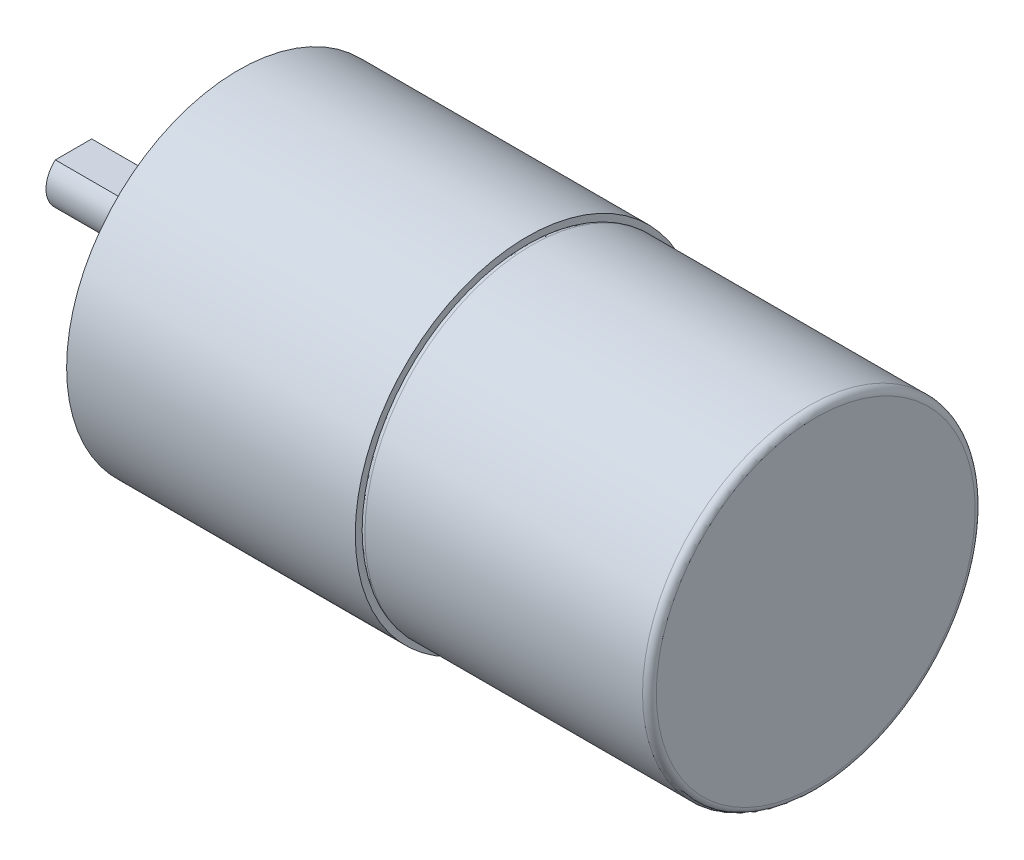
ISO-10303-21;
HEADER;
FILE_DESCRIPTION(('STEP AP214'),'2;1');
FILE_NAME('part.step','',(''),(''),'','','');
FILE_SCHEMA(('AUTOMOTIVE_DESIGN { 1 0 10303 214 1 1 1 1 }'));
ENDSEC;
DATA;
#1=APPLICATION_CONTEXT('core data for automotive mechanical design processes');
#2=APPLICATION_PROTOCOL_DEFINITION('international standard','automotive_design',2000,#1);
#3=PRODUCT_CONTEXT('',#1,'mechanical');
#4=PRODUCT('Part','Part','',(#3));
#5=PRODUCT_RELATED_PRODUCT_CATEGORY('part','',(#4));
#6=PRODUCT_DEFINITION_FORMATION('','',#4);
#7=PRODUCT_DEFINITION_CONTEXT('part definition',#1,'design');
#8=PRODUCT_DEFINITION('design','',#6,#7);
#9=PRODUCT_DEFINITION_SHAPE('','',#8);
#10=(LENGTH_UNIT() NAMED_UNIT(*) SI_UNIT(.MILLI.,.METRE.));
#11=(NAMED_UNIT(*) PLANE_ANGLE_UNIT() SI_UNIT($,.RADIAN.));
#12=(NAMED_UNIT(*) SI_UNIT($,.STERADIAN.) SOLID_ANGLE_UNIT());
#13=UNCERTAINTY_MEASURE_WITH_UNIT(LENGTH_MEASURE(1.E-05),#10,'distance_accuracy_value','');
#14=(GEOMETRIC_REPRESENTATION_CONTEXT(3) GLOBAL_UNCERTAINTY_ASSIGNED_CONTEXT((#13)) GLOBAL_UNIT_ASSIGNED_CONTEXT((#10,
#11,#12)) REPRESENTATION_CONTEXT('',''));
#15=CARTESIAN_POINT('',(0.,0.,0.));
#16=DIRECTION('',(0.,0.,1.));
#17=DIRECTION('',(1.,0.,0.));
#18=AXIS2_PLACEMENT_3D('',#15,#16,#17);
#19=CARTESIAN_POINT('',(-17.5,2.,0.));
#20=DIRECTION('',(1.,0.,0.));
#21=DIRECTION('',(0.,0.,-1.));
#22=AXIS2_PLACEMENT_3D('',#19,#20,#21);
#23=PLANE('',#22);
#24=CARTESIAN_POINT('',(-17.5,0.,0.));
#25=DIRECTION('',(-1.,0.,0.));
#26=DIRECTION('',(0.,0.,1.));
#27=AXIS2_PLACEMENT_3D('',#24,#25,#26);
#28=CIRCLE('',#27,2.);
#29=CARTESIAN_POINT('',(-17.5,0.,2.));
#30=VERTEX_POINT('',#29);
#31=EDGE_CURVE('E90',#30,#30,#28,.T.);
#32=ORIENTED_EDGE('',*,*,#31,.F.);
#33=EDGE_LOOP('',(#32));
#34=FACE_BOUND('',#33,.T.);
#35=CARTESIAN_POINT('',(-17.5,0.,0.));
#36=DIRECTION('',(-1.,0.,0.));
#37=DIRECTION('',(0.,0.,1.));
#38=AXIS2_PLACEMENT_3D('',#35,#36,#37);
#39=CIRCLE('',#38,3.5);
#40=CARTESIAN_POINT('',(-17.5,0.,3.5));
#41=VERTEX_POINT('',#40);
#42=EDGE_CURVE('E111',#41,#41,#39,.T.);
#43=ORIENTED_EDGE('',*,*,#42,.T.);
#44=EDGE_LOOP('',(#43));
#45=FACE_BOUND('',#44,.T.);
#46=ADVANCED_FACE('F45',(#34,#45),#23,.F.);
#47=CARTESIAN_POINT('',(-27.,0.,0.));
#48=DIRECTION('',(-1.,0.,0.));
#49=DIRECTION('',(0.,0.,1.));
#50=AXIS2_PLACEMENT_3D('',#47,#48,#49);
#51=CYLINDRICAL_SURFACE('',#50,3.5);
#52=ORIENTED_EDGE('',*,*,#42,.F.);
#53=EDGE_LOOP('',(#52));
#54=FACE_BOUND('',#53,.T.);
#55=CARTESIAN_POINT('',(-15.,0.,0.));
#56=DIRECTION('',(-1.,0.,0.));
#57=DIRECTION('',(0.,0.,1.));
#58=AXIS2_PLACEMENT_3D('',#55,#56,#57);
#59=CIRCLE('',#58,3.5);
#60=CARTESIAN_POINT('',(-15.,0.,3.5));
#61=VERTEX_POINT('',#60);
#62=EDGE_CURVE('E107',#61,#61,#59,.T.);
#63=ORIENTED_EDGE('',*,*,#62,.T.);
#64=EDGE_LOOP('',(#63));
#65=FACE_BOUND('',#64,.T.);
#66=ADVANCED_FACE('F159',(#54,#65),#51,.T.);
#67=CARTESIAN_POINT('',(-15.,3.5,0.));
#68=DIRECTION('',(1.,0.,0.));
#69=DIRECTION('',(0.,0.,-1.));
#70=AXIS2_PLACEMENT_3D('',#67,#68,#69);
#71=PLANE('',#70);
#72=CARTESIAN_POINT('',(-15.,8.5,0.));
#73=DIRECTION('',(-1.,0.,0.));
#74=DIRECTION('',(0.,0.,1.));
#75=AXIS2_PLACEMENT_3D('',#72,#73,#74);
#76=CIRCLE('',#75,1.5);
#77=CARTESIAN_POINT('',(-15.,8.5,1.5));
#78=VERTEX_POINT('',#77);
#79=EDGE_CURVE('E179',#78,#78,#76,.T.);
#80=ORIENTED_EDGE('',*,*,#79,.F.);
#81=EDGE_LOOP('',(#80));
#82=FACE_BOUND('',#81,.T.);
#83=CARTESIAN_POINT('',(-15.,-8.5,0.));
#84=DIRECTION('',(-1.,0.,0.));
#85=DIRECTION('',(0.,0.,1.));
#86=AXIS2_PLACEMENT_3D('',#83,#84,#85);
#87=CIRCLE('',#86,1.5);
#88=CARTESIAN_POINT('',(-15.,-8.5,1.5));
#89=VERTEX_POINT('',#88);
#90=EDGE_CURVE('E183',#89,#89,#87,.T.);
#91=ORIENTED_EDGE('',*,*,#90,.F.);
#92=EDGE_LOOP('',(#91));
#93=FACE_BOUND('',#92,.T.);
#94=ORIENTED_EDGE('',*,*,#62,.F.);
#95=EDGE_LOOP('',(#94));
#96=FACE_BOUND('',#95,.T.);
#97=CARTESIAN_POINT('',(-15.,0.,0.));
#98=DIRECTION('',(-1.,0.,0.));
#99=DIRECTION('',(0.,0.,1.));
#100=AXIS2_PLACEMENT_3D('',#97,#98,#99);
#101=CIRCLE('',#100,12.5);
#102=CARTESIAN_POINT('',(-15.,0.,12.5));
#103=VERTEX_POINT('',#102);
#104=EDGE_CURVE('E103',#103,#103,#101,.T.);
#105=ORIENTED_EDGE('',*,*,#104,.T.);
#106=EDGE_LOOP('',(#105));
#107=FACE_BOUND('',#106,.T.);
#108=ADVANCED_FACE('F154',(#82,#93,#96,#107),#71,.F.);
#109=CARTESIAN_POINT('',(-27.,0.,0.));
#110=DIRECTION('',(-1.,0.,0.));
#111=DIRECTION('',(0.,0.,1.));
#112=AXIS2_PLACEMENT_3D('',#109,#110,#111);
#113=CYLINDRICAL_SURFACE('',#112,12.5);
#114=ORIENTED_EDGE('',*,*,#104,.F.);
#115=EDGE_LOOP('',(#114));
#116=FACE_BOUND('',#115,.T.);
#117=CARTESIAN_POINT('',(6.,0.,0.));
#118=DIRECTION('',(-1.,0.,0.));
#119=DIRECTION('',(0.,0.,1.));
#120=AXIS2_PLACEMENT_3D('',#117,#118,#119);
#121=CIRCLE('',#120,12.5);
#122=CARTESIAN_POINT('',(6.,0.,12.5));
#123=VERTEX_POINT('',#122);
#124=EDGE_CURVE('E95',#123,#123,#121,.T.);
#125=ORIENTED_EDGE('',*,*,#124,.T.);
#126=EDGE_LOOP('',(#125));
#127=FACE_BOUND('',#126,.T.);
#128=ADVANCED_FACE('F148',(#116,#127),#113,.T.);
#129=CARTESIAN_POINT('',(6.,12.5,0.));
#130=DIRECTION('',(-1.,0.,0.));
#131=DIRECTION('',(0.,0.,1.));
#132=AXIS2_PLACEMENT_3D('',#129,#130,#131);
#133=PLANE('',#132);
#134=ORIENTED_EDGE('',*,*,#124,.F.);
#135=EDGE_LOOP('',(#134));
#136=FACE_BOUND('',#135,.T.);
#137=CARTESIAN_POINT('',(6.,0.,0.));
#138=DIRECTION('',(-1.,0.,0.));
#139=DIRECTION('',(0.,0.,1.));
#140=AXIS2_PLACEMENT_3D('',#137,#138,#139);
#141=CIRCLE('',#140,12.);
#142=CARTESIAN_POINT('',(6.,0.,12.));
#143=VERTEX_POINT('',#142);
#144=EDGE_CURVE('E89',#143,#143,#141,.T.);
#145=ORIENTED_EDGE('',*,*,#144,.T.);
#146=EDGE_LOOP('',(#145));
#147=FACE_BOUND('',#146,.T.);
#148=ADVANCED_FACE('F138',(#136,#147),#133,.F.);
#149=CARTESIAN_POINT('',(-27.,0.,0.));
#150=DIRECTION('',(-1.,0.,0.));
#151=DIRECTION('',(0.,0.,1.));
#152=AXIS2_PLACEMENT_3D('',#149,#150,#151);
#153=CYLINDRICAL_SURFACE('',#152,12.1);
#154=CARTESIAN_POINT('',(26.5,0.,0.));
#155=DIRECTION('',(-1.,0.,0.));
#156=DIRECTION('',(0.,0.,1.));
#157=AXIS2_PLACEMENT_3D('',#154,#155,#156);
#158=CIRCLE('',#157,12.1);
#159=CARTESIAN_POINT('',(26.5,0.,12.1));
#160=VERTEX_POINT('',#159);
#161=EDGE_CURVE('E119',#160,#160,#158,.T.);
#162=ORIENTED_EDGE('',*,*,#161,.T.);
#163=EDGE_LOOP('',(#162));
#164=FACE_BOUND('',#163,.T.);
#165=CARTESIAN_POINT('',(6.3,0.,0.));
#166=DIRECTION('',(-1.,0.,0.));
#167=DIRECTION('',(0.,0.,1.));
#168=AXIS2_PLACEMENT_3D('',#165,#166,#167);
#169=CIRCLE('',#168,12.1);
#170=CARTESIAN_POINT('',(6.3,0.,12.1));
#171=VERTEX_POINT('',#170);
#172=EDGE_CURVE('E115',#171,#171,#169,.F.);
#173=ORIENTED_EDGE('',*,*,#172,.T.);
#174=EDGE_LOOP('',(#173));
#175=FACE_BOUND('',#174,.T.);
#176=ADVANCED_FACE('F135',(#164,#175),#153,.T.);
#177=CARTESIAN_POINT('',(27.,12.1,0.));
#178=DIRECTION('',(-1.,0.,0.));
#179=DIRECTION('',(0.,0.,1.));
#180=AXIS2_PLACEMENT_3D('',#177,#178,#179);
#181=PLANE('',#180);
#182=CARTESIAN_POINT('',(27.,0.,0.));
#183=DIRECTION('',(-1.,0.,0.));
#184=DIRECTION('',(0.,0.,1.));
#185=AXIS2_PLACEMENT_3D('',#182,#183,#184);
#186=CIRCLE('',#185,11.6);
#187=CARTESIAN_POINT('',(27.,0.,11.6));
#188=VERTEX_POINT('',#187);
#189=EDGE_CURVE('E77',#188,#188,#186,.F.);
#190=ORIENTED_EDGE('',*,*,#189,.T.);
#191=EDGE_LOOP('',(#190));
#192=FACE_BOUND('',#191,.T.);
#193=ADVANCED_FACE('F128',(#192),#181,.F.);
#194=CARTESIAN_POINT('',(-27.,0.,0.));
#195=DIRECTION('',(1.,0.,0.));
#196=DIRECTION('',(0.,0.,-1.));
#197=AXIS2_PLACEMENT_3D('',#194,#195,#196);
#198=PLANE('',#197);
#199=CARTESIAN_POINT('',(-27.,0.,0.));
#200=DIRECTION('',(-1.,0.,0.));
#201=DIRECTION('',(0.,0.,1.));
#202=AXIS2_PLACEMENT_3D('',#199,#200,#201);
#203=CIRCLE('',#202,2.);
#204=CARTESIAN_POINT('',(-27.,1.5,-1.3228756555323));
#205=VERTEX_POINT('',#204);
#206=CARTESIAN_POINT('',(-27.,1.5,1.3228756555323));
#207=VERTEX_POINT('',#206);
#208=EDGE_CURVE('E82',#205,#207,#203,.T.);
#209=ORIENTED_EDGE('',*,*,#208,.T.);
#210=DIRECTION('',(0.,0.,1.));
#211=VECTOR('',#210,1.);
#212=CARTESIAN_POINT('',(-27.,1.5,-5.));
#213=LINE('',#212,#211);
#214=EDGE_CURVE('E74',#205,#207,#213,.T.);
#215=ORIENTED_EDGE('',*,*,#214,.F.);
#216=EDGE_LOOP('',(#209,#215));
#217=FACE_BOUND('',#216,.T.);
#218=ADVANCED_FACE('F81',(#217),#198,.F.);
#219=CARTESIAN_POINT('',(-27.,0.,0.));
#220=DIRECTION('',(-1.,0.,0.));
#221=DIRECTION('',(0.,0.,1.));
#222=AXIS2_PLACEMENT_3D('',#219,#220,#221);
#223=CYLINDRICAL_SURFACE('',#222,2.);
#224=CARTESIAN_POINT('',(-19.,0.,0.));
#225=DIRECTION('',(1.,0.,0.));
#226=DIRECTION('',(0.,0.,-1.));
#227=AXIS2_PLACEMENT_3D('',#224,#225,#226);
#228=CIRCLE('',#227,2.);
#229=CARTESIAN_POINT('',(-19.,1.5,-1.3228756555323));
#230=VERTEX_POINT('',#229);
#231=CARTESIAN_POINT('',(-19.,1.5,1.3228756555323));
#232=VERTEX_POINT('',#231);
#233=EDGE_CURVE('E54',#230,#232,#228,.T.);
#234=ORIENTED_EDGE('',*,*,#233,.T.);
#235=DIRECTION('',(-1.,0.,0.));
#236=VECTOR('',#235,1.);
#237=CARTESIAN_POINT('',(-27.,1.5,1.3228756555323));
#238=LINE('',#237,#236);
#239=EDGE_CURVE('E11',#232,#207,#238,.T.);
#240=ORIENTED_EDGE('',*,*,#239,.T.);
#241=ORIENTED_EDGE('',*,*,#208,.F.);
#242=DIRECTION('',(-1.,0.,0.));
#243=VECTOR('',#242,1.);
#244=CARTESIAN_POINT('',(-27.,1.5,-1.3228756555323));
#245=LINE('',#244,#243);
#246=EDGE_CURVE('E71',#205,#230,#245,.F.);
#247=ORIENTED_EDGE('',*,*,#246,.T.);
#248=EDGE_LOOP('',(#234,#240,#241,#247));
#249=FACE_BOUND('',#248,.T.);
#250=ORIENTED_EDGE('',*,*,#31,.T.);
#251=EDGE_LOOP('',(#250));
#252=FACE_BOUND('',#251,.T.);
#253=ADVANCED_FACE('F86',(#249,#252),#223,.T.);
#254=CARTESIAN_POINT('',(26.5,0.,0.));
#255=DIRECTION('',(-1.,0.,0.));
#256=DIRECTION('',(0.,0.,1.));
#257=AXIS2_PLACEMENT_3D('',#254,#255,#256);
#258=TOROIDAL_SURFACE('',#257,11.6,0.5);
#259=ORIENTED_EDGE('',*,*,#189,.F.);
#260=EDGE_LOOP('',(#259));
#261=FACE_BOUND('',#260,.T.);
#262=ORIENTED_EDGE('',*,*,#161,.F.);
#263=EDGE_LOOP('',(#262));
#264=FACE_BOUND('',#263,.T.);
#265=ADVANCED_FACE('F130',(#261,#264),#258,.T.);
#266=CARTESIAN_POINT('',(6.3,0.,0.));
#267=DIRECTION('',(-1.,0.,0.));
#268=DIRECTION('',(0.,0.,1.));
#269=AXIS2_PLACEMENT_3D('',#266,#267,#268);
#270=TOROIDAL_SURFACE('',#269,11.6,0.5);
#271=ORIENTED_EDGE('',*,*,#172,.F.);
#272=EDGE_LOOP('',(#271));
#273=FACE_BOUND('',#272,.T.);
#274=ORIENTED_EDGE('',*,*,#144,.F.);
#275=EDGE_LOOP('',(#274));
#276=FACE_BOUND('',#275,.T.);
#277=ADVANCED_FACE('F47',(#273,#276),#270,.T.);
#278=CARTESIAN_POINT('',(-19.,2.,-5.));
#279=DIRECTION('',(1.,0.,0.));
#280=DIRECTION('',(0.,0.,-1.));
#281=AXIS2_PLACEMENT_3D('',#278,#279,#280);
#282=PLANE('',#281);
#283=DIRECTION('',(0.,0.,1.));
#284=VECTOR('',#283,1.);
#285=CARTESIAN_POINT('',(-19.,1.5,-5.));
#286=LINE('',#285,#284);
#287=EDGE_CURVE('E61',#230,#232,#286,.T.);
#288=ORIENTED_EDGE('',*,*,#287,.T.);
#289=ORIENTED_EDGE('',*,*,#233,.F.);
#290=EDGE_LOOP('',(#288,#289));
#291=FACE_BOUND('',#290,.T.);
#292=ADVANCED_FACE('F144',(#291),#282,.F.);
#293=CARTESIAN_POINT('',(-27.,1.5,-5.));
#294=DIRECTION('',(0.,-1.,0.));
#295=DIRECTION('',(0.,0.,-1.));
#296=AXIS2_PLACEMENT_3D('',#293,#294,#295);
#297=PLANE('',#296);
#298=ORIENTED_EDGE('',*,*,#287,.F.);
#299=ORIENTED_EDGE('',*,*,#246,.F.);
#300=ORIENTED_EDGE('',*,*,#214,.T.);
#301=ORIENTED_EDGE('',*,*,#239,.F.);
#302=EDGE_LOOP('',(#298,#299,#300,#301));
#303=FACE_BOUND('',#302,.T.);
#304=ADVANCED_FACE('F73',(#303),#297,.F.);
#305=CARTESIAN_POINT('',(-10.,-8.5,0.));
#306=DIRECTION('',(-1.,0.,0.));
#307=DIRECTION('',(0.,0.,1.));
#308=AXIS2_PLACEMENT_3D('',#305,#306,#307);
#309=CYLINDRICAL_SURFACE('',#308,1.5);
#310=CARTESIAN_POINT('',(-10.,-8.5,0.));
#311=DIRECTION('',(-1.,0.,0.));
#312=DIRECTION('',(0.,0.,1.));
#313=AXIS2_PLACEMENT_3D('',#310,#311,#312);
#314=CIRCLE('',#313,1.5);
#315=CARTESIAN_POINT('',(-10.,-8.5,1.5));
#316=VERTEX_POINT('',#315);
#317=EDGE_CURVE('E191',#316,#316,#314,.T.);
#318=ORIENTED_EDGE('',*,*,#317,.F.);
#319=EDGE_LOOP('',(#318));
#320=FACE_BOUND('',#319,.T.);
#321=ORIENTED_EDGE('',*,*,#90,.T.);
#322=EDGE_LOOP('',(#321));
#323=FACE_BOUND('',#322,.T.);
#324=ADVANCED_FACE('F207',(#320,#323),#309,.F.);
#325=CARTESIAN_POINT('',(-10.,-8.5,0.));
#326=DIRECTION('',(-1.,0.,0.));
#327=DIRECTION('',(0.,0.,1.));
#328=AXIS2_PLACEMENT_3D('',#325,#326,#327);
#329=PLANE('',#328);
#330=ORIENTED_EDGE('',*,*,#317,.T.);
#331=EDGE_LOOP('',(#330));
#332=FACE_BOUND('',#331,.T.);
#333=ADVANCED_FACE('F210',(#332),#329,.T.);
#334=CARTESIAN_POINT('',(-10.,8.5,0.));
#335=DIRECTION('',(-1.,0.,0.));
#336=DIRECTION('',(0.,0.,1.));
#337=AXIS2_PLACEMENT_3D('',#334,#335,#336);
#338=CYLINDRICAL_SURFACE('',#337,1.5);
#339=CARTESIAN_POINT('',(-10.,8.5,0.));
#340=DIRECTION('',(-1.,0.,0.));
#341=DIRECTION('',(0.,0.,1.));
#342=AXIS2_PLACEMENT_3D('',#339,#340,#341);
#343=CIRCLE('',#342,1.5);
#344=CARTESIAN_POINT('',(-10.,8.5,1.5));
#345=VERTEX_POINT('',#344);
#346=EDGE_CURVE('E84',#345,#345,#343,.T.);
#347=ORIENTED_EDGE('',*,*,#346,.F.);
#348=EDGE_LOOP('',(#347));
#349=FACE_BOUND('',#348,.T.);
#350=ORIENTED_EDGE('',*,*,#79,.T.);
#351=EDGE_LOOP('',(#350));
#352=FACE_BOUND('',#351,.T.);
#353=ADVANCED_FACE('F268',(#349,#352),#338,.F.);
#354=CARTESIAN_POINT('',(-10.,8.5,0.));
#355=DIRECTION('',(-1.,0.,0.));
#356=DIRECTION('',(0.,0.,1.));
#357=AXIS2_PLACEMENT_3D('',#354,#355,#356);
#358=PLANE('',#357);
#359=ORIENTED_EDGE('',*,*,#346,.T.);
#360=EDGE_LOOP('',(#359));
#361=FACE_BOUND('',#360,.T.);
#362=ADVANCED_FACE('F276',(#361),#358,.T.);
#363=CLOSED_SHELL('',(#46,#66,#108,#128,#148,#176,#193,#218,#253,#265,#277,#292,#304,#324,#333,
#353,#362));
#364=MANIFOLD_SOLID_BREP('B2',#363);
#365=ADVANCED_BREP_SHAPE_REPRESENTATION('',(#18,#364),#14);
#366=SHAPE_DEFINITION_REPRESENTATION(#9,#365);
ENDSEC;
END-ISO-10303-21;
